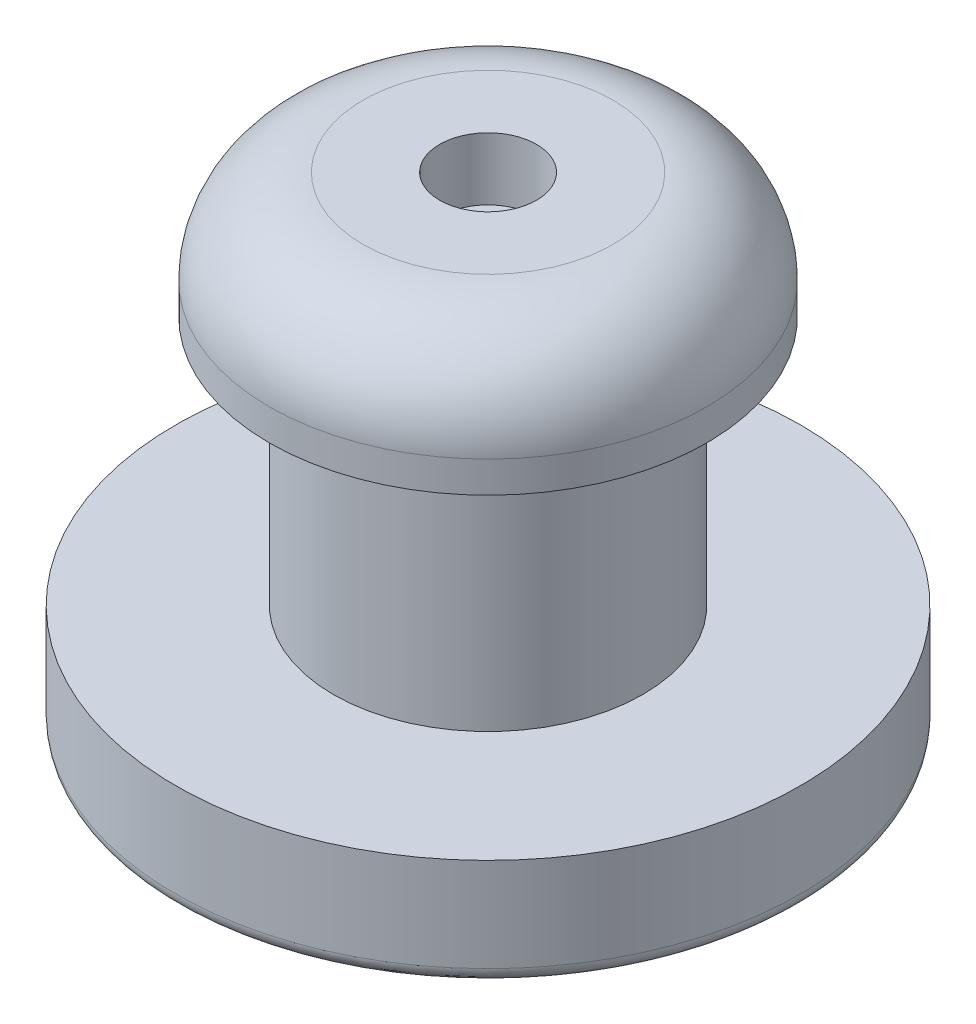
ISO-10303-21;
HEADER;
FILE_DESCRIPTION(('STEP AP214'),'2;1');
FILE_NAME('part.step','',(''),(''),'','','');
FILE_SCHEMA(('AUTOMOTIVE_DESIGN { 1 0 10303 214 1 1 1 1 }'));
ENDSEC;
DATA;
#1=APPLICATION_CONTEXT('core data for automotive mechanical design processes');
#2=APPLICATION_PROTOCOL_DEFINITION('international standard','automotive_design',2000,#1);
#3=PRODUCT_CONTEXT('',#1,'mechanical');
#4=PRODUCT('Part','Part','',(#3));
#5=PRODUCT_RELATED_PRODUCT_CATEGORY('part','',(#4));
#6=PRODUCT_DEFINITION_FORMATION('','',#4);
#7=PRODUCT_DEFINITION_CONTEXT('part definition',#1,'design');
#8=PRODUCT_DEFINITION('design','',#6,#7);
#9=PRODUCT_DEFINITION_SHAPE('','',#8);
#10=(LENGTH_UNIT() NAMED_UNIT(*) SI_UNIT(.MILLI.,.METRE.));
#11=(NAMED_UNIT(*) PLANE_ANGLE_UNIT() SI_UNIT($,.RADIAN.));
#12=(NAMED_UNIT(*) SI_UNIT($,.STERADIAN.) SOLID_ANGLE_UNIT());
#13=UNCERTAINTY_MEASURE_WITH_UNIT(LENGTH_MEASURE(1.E-05),#10,'distance_accuracy_value','');
#14=(GEOMETRIC_REPRESENTATION_CONTEXT(3) GLOBAL_UNCERTAINTY_ASSIGNED_CONTEXT((#13)) GLOBAL_UNIT_ASSIGNED_CONTEXT((#10,
#11,#12)) REPRESENTATION_CONTEXT('',''));
#15=CARTESIAN_POINT('',(0.,0.,0.));
#16=DIRECTION('',(0.,0.,1.));
#17=DIRECTION('',(1.,0.,0.));
#18=AXIS2_PLACEMENT_3D('',#15,#16,#17);
#19=CARTESIAN_POINT('',(0.,8.,0.));
#20=DIRECTION('',(0.,1.,0.));
#21=DIRECTION('',(0.,0.,1.));
#22=AXIS2_PLACEMENT_3D('',#19,#20,#21);
#23=PLANE('',#22);
#24=CARTESIAN_POINT('',(0.,8.,0.));
#25=DIRECTION('',(0.,1.,0.));
#26=DIRECTION('',(0.,0.,1.));
#27=AXIS2_PLACEMENT_3D('',#24,#25,#26);
#28=CIRCLE('',#27,7.);
#29=CARTESIAN_POINT('',(0.,8.,7.));
#30=VERTEX_POINT('',#29);
#31=EDGE_CURVE('E56',#30,#30,#28,.T.);
#32=ORIENTED_EDGE('',*,*,#31,.F.);
#33=EDGE_LOOP('',(#32));
#34=FACE_BOUND('',#33,.T.);
#35=CARTESIAN_POINT('',(0.,8.,0.));
#36=DIRECTION('',(0.,1.,0.));
#37=DIRECTION('',(0.,0.,1.));
#38=AXIS2_PLACEMENT_3D('',#35,#36,#37);
#39=CIRCLE('',#38,5.05);
#40=CARTESIAN_POINT('',(0.,8.,5.05));
#41=VERTEX_POINT('',#40);
#42=EDGE_CURVE('E60',#41,#41,#39,.T.);
#43=ORIENTED_EDGE('',*,*,#42,.T.);
#44=EDGE_LOOP('',(#43));
#45=FACE_BOUND('',#44,.T.);
#46=ADVANCED_FACE('F45',(#34,#45),#23,.F.);
#47=CARTESIAN_POINT('',(0.,10.,0.));
#48=DIRECTION('',(0.,-1.,0.));
#49=DIRECTION('',(0.,0.,-1.));
#50=AXIS2_PLACEMENT_3D('',#47,#48,#49);
#51=CYLINDRICAL_SURFACE('',#50,7.);
#52=CARTESIAN_POINT('',(0.,9.,0.));
#53=DIRECTION('',(0.,1.,0.));
#54=DIRECTION('',(0.,0.,1.));
#55=AXIS2_PLACEMENT_3D('',#52,#53,#54);
#56=CIRCLE('',#55,7.);
#57=CARTESIAN_POINT('',(0.,9.,7.));
#58=VERTEX_POINT('',#57);
#59=EDGE_CURVE('E11',#58,#58,#56,.F.);
#60=ORIENTED_EDGE('',*,*,#59,.T.);
#61=EDGE_LOOP('',(#60));
#62=FACE_BOUND('',#61,.T.);
#63=ORIENTED_EDGE('',*,*,#31,.T.);
#64=EDGE_LOOP('',(#63));
#65=FACE_BOUND('',#64,.T.);
#66=ADVANCED_FACE('F91',(#62,#65),#51,.T.);
#67=CARTESIAN_POINT('',(0.,10.,0.));
#68=DIRECTION('',(0.,-1.,0.));
#69=DIRECTION('',(0.,0.,-1.));
#70=AXIS2_PLACEMENT_3D('',#67,#68,#69);
#71=CYLINDRICAL_SURFACE('',#70,5.05);
#72=CARTESIAN_POINT('',(0.,10.,0.));
#73=DIRECTION('',(0.,1.,0.));
#74=DIRECTION('',(0.,0.,1.));
#75=AXIS2_PLACEMENT_3D('',#72,#73,#74);
#76=CIRCLE('',#75,5.05);
#77=CARTESIAN_POINT('',(0.,10.,5.05));
#78=VERTEX_POINT('',#77);
#79=EDGE_CURVE('E65',#78,#78,#76,.T.);
#80=ORIENTED_EDGE('',*,*,#79,.T.);
#81=EDGE_LOOP('',(#80));
#82=FACE_BOUND('',#81,.T.);
#83=ORIENTED_EDGE('',*,*,#42,.F.);
#84=EDGE_LOOP('',(#83));
#85=FACE_BOUND('',#84,.T.);
#86=ADVANCED_FACE('F87',(#82,#85),#71,.F.);
#87=CARTESIAN_POINT('',(0.,10.,0.));
#88=DIRECTION('',(0.,1.,0.));
#89=DIRECTION('',(0.,0.,1.));
#90=AXIS2_PLACEMENT_3D('',#87,#88,#89);
#91=PLANE('',#90);
#92=CARTESIAN_POINT('',(0.,10.,0.));
#93=DIRECTION('',(0.,1.,0.));
#94=DIRECTION('',(0.,0.,1.));
#95=AXIS2_PLACEMENT_3D('',#92,#93,#94);
#96=CIRCLE('',#95,1.55);
#97=CARTESIAN_POINT('',(0.,10.,1.55));
#98=VERTEX_POINT('',#97);
#99=EDGE_CURVE('E68',#98,#98,#96,.T.);
#100=ORIENTED_EDGE('',*,*,#99,.T.);
#101=EDGE_LOOP('',(#100));
#102=FACE_BOUND('',#101,.T.);
#103=ORIENTED_EDGE('',*,*,#79,.F.);
#104=EDGE_LOOP('',(#103));
#105=FACE_BOUND('',#104,.T.);
#106=ADVANCED_FACE('F80',(#102,#105),#91,.F.);
#107=CARTESIAN_POINT('',(0.,12.,0.));
#108=DIRECTION('',(0.,1.,0.));
#109=DIRECTION('',(0.,0.,1.));
#110=AXIS2_PLACEMENT_3D('',#107,#108,#109);
#111=PLANE('',#110);
#112=CARTESIAN_POINT('',(0.,12.,0.));
#113=DIRECTION('',(0.,1.,0.));
#114=DIRECTION('',(0.,0.,1.));
#115=AXIS2_PLACEMENT_3D('',#112,#113,#114);
#116=CIRCLE('',#115,4.);
#117=CARTESIAN_POINT('',(0.,12.,4.));
#118=VERTEX_POINT('',#117);
#119=EDGE_CURVE('E52',#118,#118,#116,.T.);
#120=ORIENTED_EDGE('',*,*,#119,.T.);
#121=EDGE_LOOP('',(#120));
#122=FACE_BOUND('',#121,.T.);
#123=CARTESIAN_POINT('',(0.,12.,0.));
#124=DIRECTION('',(0.,1.,0.));
#125=DIRECTION('',(0.,0.,1.));
#126=AXIS2_PLACEMENT_3D('',#123,#124,#125);
#127=CIRCLE('',#126,1.55);
#128=CARTESIAN_POINT('',(0.,12.,1.55));
#129=VERTEX_POINT('',#128);
#130=EDGE_CURVE('E71',#129,#129,#127,.T.);
#131=ORIENTED_EDGE('',*,*,#130,.F.);
#132=EDGE_LOOP('',(#131));
#133=FACE_BOUND('',#132,.T.);
#134=ADVANCED_FACE('F78',(#122,#133),#111,.T.);
#135=CARTESIAN_POINT('',(0.,-3.5,0.));
#136=DIRECTION('',(0.,1.,0.));
#137=DIRECTION('',(0.,0.,1.));
#138=AXIS2_PLACEMENT_3D('',#135,#136,#137);
#139=CYLINDRICAL_SURFACE('',#138,1.55);
#140=ORIENTED_EDGE('',*,*,#130,.T.);
#141=EDGE_LOOP('',(#140));
#142=FACE_BOUND('',#141,.T.);
#143=ORIENTED_EDGE('',*,*,#99,.F.);
#144=EDGE_LOOP('',(#143));
#145=FACE_BOUND('',#144,.T.);
#146=ADVANCED_FACE('F75',(#142,#145),#139,.F.);
#147=CARTESIAN_POINT('',(0.,9.,0.));
#148=DIRECTION('',(0.,1.,0.));
#149=DIRECTION('',(0.,0.,1.));
#150=AXIS2_PLACEMENT_3D('',#147,#148,#149);
#151=TOROIDAL_SURFACE('',#150,4.,3.);
#152=ORIENTED_EDGE('',*,*,#59,.F.);
#153=EDGE_LOOP('',(#152));
#154=FACE_BOUND('',#153,.T.);
#155=ORIENTED_EDGE('',*,*,#119,.F.);
#156=EDGE_LOOP('',(#155));
#157=FACE_BOUND('',#156,.T.);
#158=ADVANCED_FACE('F47',(#154,#157),#151,.T.);
#159=CLOSED_SHELL('',(#46,#66,#86,#106,#134,#146,#158));
#160=MANIFOLD_SOLID_BREP('B2',#159);
#161=CARTESIAN_POINT('',(0.,-3.5,0.));
#162=DIRECTION('',(0.,1.,0.));
#163=DIRECTION('',(0.,0.,1.));
#164=AXIS2_PLACEMENT_3D('',#161,#162,#163);
#165=CYLINDRICAL_SURFACE('',#164,1.55);
#166=CARTESIAN_POINT('',(0.,9.,0.));
#167=DIRECTION('',(0.,1.,0.));
#168=DIRECTION('',(0.,0.,1.));
#169=AXIS2_PLACEMENT_3D('',#166,#167,#168);
#170=CIRCLE('',#169,1.55);
#171=CARTESIAN_POINT('',(0.,9.,1.55));
#172=VERTEX_POINT('',#171);
#173=EDGE_CURVE('E263',#172,#172,#170,.T.);
#174=CARTESIAN_POINT('',(0.,0.5,0.));
#175=DIRECTION('',(0.,-1.,0.));
#176=DIRECTION('',(0.,0.,-1.));
#177=AXIS2_PLACEMENT_3D('',#174,#175,#176);
#178=CIRCLE('',#177,1.55);
#179=CARTESIAN_POINT('',(0.,0.500000000000001,1.55));
#180=VERTEX_POINT('',#179);
#181=EDGE_CURVE('E257',#180,#180,#178,.F.);
#182=CARTESIAN_POINT('',(0.,9.,1.55));
#183=CARTESIAN_POINT('',(0.,8.91145833333333,1.55));
#184=CARTESIAN_POINT('',(0.,8.82291666666667,1.55));
#185=CARTESIAN_POINT('',(0.,8.64583333333333,1.55));
#186=CARTESIAN_POINT('',(0.,8.55729166666667,1.55));
#187=CARTESIAN_POINT('',(0.,8.38020833333333,1.55));
#188=CARTESIAN_POINT('',(0.,8.29166666666667,1.55));
#189=CARTESIAN_POINT('',(0.,8.11458333333333,1.55));
#190=CARTESIAN_POINT('',(0.,8.02604166666667,1.55));
#191=CARTESIAN_POINT('',(0.,7.84895833333333,1.55));
#192=CARTESIAN_POINT('',(0.,7.76041666666667,1.55));
#193=CARTESIAN_POINT('',(0.,7.58333333333333,1.55));
#194=CARTESIAN_POINT('',(0.,7.49479166666667,1.55));
#195=CARTESIAN_POINT('',(0.,7.31770833333333,1.55));
#196=CARTESIAN_POINT('',(0.,7.22916666666667,1.55));
#197=CARTESIAN_POINT('',(0.,7.05208333333333,1.55));
#198=CARTESIAN_POINT('',(0.,6.96354166666667,1.55));
#199=CARTESIAN_POINT('',(0.,6.78645833333333,1.55));
#200=CARTESIAN_POINT('',(0.,6.69791666666667,1.55));
#201=CARTESIAN_POINT('',(0.,6.52083333333333,1.55));
#202=CARTESIAN_POINT('',(0.,6.43229166666667,1.55));
#203=CARTESIAN_POINT('',(0.,6.25520833333333,1.55));
#204=CARTESIAN_POINT('',(0.,6.16666666666667,1.55));
#205=CARTESIAN_POINT('',(0.,5.98958333333333,1.55));
#206=CARTESIAN_POINT('',(0.,5.90104166666667,1.55));
#207=CARTESIAN_POINT('',(0.,5.72395833333333,1.55));
#208=CARTESIAN_POINT('',(0.,5.63541666666667,1.55));
#209=CARTESIAN_POINT('',(0.,5.45833333333333,1.55));
#210=CARTESIAN_POINT('',(0.,5.36979166666667,1.55));
#211=CARTESIAN_POINT('',(0.,5.19270833333333,1.55));
#212=CARTESIAN_POINT('',(0.,5.10416666666667,1.55));
#213=CARTESIAN_POINT('',(0.,4.92708333333333,1.55));
#214=CARTESIAN_POINT('',(0.,4.83854166666667,1.55));
#215=CARTESIAN_POINT('',(0.,4.66145833333333,1.55));
#216=CARTESIAN_POINT('',(0.,4.57291666666667,1.55));
#217=CARTESIAN_POINT('',(0.,4.39583333333333,1.55));
#218=CARTESIAN_POINT('',(0.,4.30729166666667,1.55));
#219=CARTESIAN_POINT('',(0.,4.13020833333333,1.55));
#220=CARTESIAN_POINT('',(0.,4.04166666666667,1.55));
#221=CARTESIAN_POINT('',(0.,3.86458333333333,1.55));
#222=CARTESIAN_POINT('',(0.,3.77604166666667,1.55));
#223=CARTESIAN_POINT('',(0.,3.59895833333333,1.55));
#224=CARTESIAN_POINT('',(0.,3.51041666666667,1.55));
#225=CARTESIAN_POINT('',(0.,3.33333333333333,1.55));
#226=CARTESIAN_POINT('',(0.,3.24479166666667,1.55));
#227=CARTESIAN_POINT('',(0.,3.06770833333333,1.55));
#228=CARTESIAN_POINT('',(0.,2.97916666666667,1.55));
#229=CARTESIAN_POINT('',(0.,2.80208333333333,1.55));
#230=CARTESIAN_POINT('',(0.,2.71354166666667,1.55));
#231=CARTESIAN_POINT('',(0.,2.53645833333333,1.55));
#232=CARTESIAN_POINT('',(0.,2.44791666666667,1.55));
#233=CARTESIAN_POINT('',(0.,2.27083333333333,1.55));
#234=CARTESIAN_POINT('',(0.,2.18229166666667,1.55));
#235=CARTESIAN_POINT('',(0.,2.00520833333333,1.55));
#236=CARTESIAN_POINT('',(0.,1.91666666666667,1.55));
#237=CARTESIAN_POINT('',(0.,1.73958333333333,1.55));
#238=CARTESIAN_POINT('',(0.,1.65104166666667,1.55));
#239=CARTESIAN_POINT('',(0.,1.47395833333333,1.55));
#240=CARTESIAN_POINT('',(0.,1.38541666666667,1.55));
#241=CARTESIAN_POINT('',(0.,1.20833333333333,1.55));
#242=CARTESIAN_POINT('',(0.,1.11979166666667,1.55));
#243=CARTESIAN_POINT('',(0.,0.942708333333335,1.55));
#244=CARTESIAN_POINT('',(0.,0.854166666666668,1.55));
#245=CARTESIAN_POINT('',(0.,0.677083333333335,1.55));
#246=CARTESIAN_POINT('',(0.,0.588541666666668,1.55));
#247=CARTESIAN_POINT('',(0.,0.500000000000001,1.55));
#248=B_SPLINE_CURVE_WITH_KNOTS('',3,(#182,#183,#184,#185,#186,#187,#188,#189,#190,#191,#192,
#193,#194,#195,#196,#197,#198,#199,#200,#201,#202,#203,#204,#205,#206,#207,#208,#209,#210,#211,
#212,#213,#214,#215,#216,#217,#218,#219,#220,#221,#222,#223,#224,#225,#226,#227,#228,#229,#230,
#231,#232,#233,#234,#235,#236,#237,#238,#239,#240,#241,#242,#243,#244,#245,#246,#247),
.UNSPECIFIED.,.F.,.F.,(4,2,2,2,2,2,2,2,2,2,2,2,2,2,2,2,2,2,2,2,2,2,2,2,2,2,2,2,2,2,2,2,4),(0.,
0.265625,0.53125,0.796874999999999,1.0625,1.328125,1.59375,1.859375,2.125,2.390625,2.65625,
2.921875,3.1875,3.453125,3.71875,3.984375,4.25,4.515625,4.78125,5.046875,5.3125,5.578125,
5.84375,6.109375,6.375,6.640625,6.90625,7.171875,7.4375,7.703125,7.96875,8.234375,8.5),.UNSPECIFIED.);
#249=EDGE_CURVE('BSEAM154',#172,#180,#248,.T.);
#250=ORIENTED_EDGE('',*,*,#173,.T.);
#251=ORIENTED_EDGE('',*,*,#181,.F.);
#252=ORIENTED_EDGE('',*,*,#249,.T.);
#253=ORIENTED_EDGE('',*,*,#249,.F.);
#254=EDGE_LOOP('',(#250,#252,#251,#253));
#255=FACE_BOUND('',#254,.T.);
#256=ADVANCED_FACE('F154',(#255),#165,.F.);
#257=CARTESIAN_POINT('',(0.,9.,0.));
#258=DIRECTION('',(0.,-1.,0.));
#259=DIRECTION('',(0.,0.,-1.));
#260=AXIS2_PLACEMENT_3D('',#257,#258,#259);
#261=CYLINDRICAL_SURFACE('',#260,4.95);
#262=CARTESIAN_POINT('',(0.,9.,0.));
#263=DIRECTION('',(0.,1.,0.));
#264=DIRECTION('',(0.,0.,1.));
#265=AXIS2_PLACEMENT_3D('',#262,#263,#264);
#266=CIRCLE('',#265,4.95);
#267=CARTESIAN_POINT('',(0.,9.,4.95));
#268=VERTEX_POINT('',#267);
#269=EDGE_CURVE('E276',#268,#268,#266,.T.);
#270=ORIENTED_EDGE('',*,*,#269,.F.);
#271=EDGE_LOOP('',(#270));
#272=FACE_BOUND('',#271,.T.);
#273=CARTESIAN_POINT('',(0.,0.,0.));
#274=DIRECTION('',(0.,1.,0.));
#275=DIRECTION('',(0.,0.,1.));
#276=AXIS2_PLACEMENT_3D('',#273,#274,#275);
#277=CIRCLE('',#276,4.95);
#278=CARTESIAN_POINT('',(0.,0.,4.95));
#279=VERTEX_POINT('',#278);
#280=EDGE_CURVE('E275',#279,#279,#277,.T.);
#281=ORIENTED_EDGE('',*,*,#280,.T.);
#282=EDGE_LOOP('',(#281));
#283=FACE_BOUND('',#282,.T.);
#284=ADVANCED_FACE('F299',(#272,#283),#261,.T.);
#285=CARTESIAN_POINT('',(0.,9.,0.));
#286=DIRECTION('',(0.,1.,0.));
#287=DIRECTION('',(0.,0.,1.));
#288=AXIS2_PLACEMENT_3D('',#285,#286,#287);
#289=PLANE('',#288);
#290=ORIENTED_EDGE('',*,*,#173,.F.);
#291=EDGE_LOOP('',(#290));
#292=FACE_BOUND('',#291,.T.);
#293=ORIENTED_EDGE('',*,*,#269,.T.);
#294=EDGE_LOOP('',(#293));
#295=FACE_BOUND('',#294,.T.);
#296=ADVANCED_FACE('F305',(#292,#295),#289,.T.);
#297=CARTESIAN_POINT('',(0.,-3.5,0.));
#298=DIRECTION('',(0.,1.,0.));
#299=DIRECTION('',(0.,0.,1.));
#300=AXIS2_PLACEMENT_3D('',#297,#298,#299);
#301=CYLINDRICAL_SURFACE('',#300,10.);
#302=CARTESIAN_POINT('',(0.,-3.,0.));
#303=DIRECTION('',(0.,-1.,0.));
#304=DIRECTION('',(0.,0.,-1.));
#305=AXIS2_PLACEMENT_3D('',#302,#303,#304);
#306=CIRCLE('',#305,10.);
#307=CARTESIAN_POINT('',(0.,-3.,-10.));
#308=VERTEX_POINT('',#307);
#309=EDGE_CURVE('E43',#308,#308,#306,.F.);
#310=ORIENTED_EDGE('',*,*,#309,.T.);
#311=EDGE_LOOP('',(#310));
#312=FACE_BOUND('',#311,.T.);
#313=CARTESIAN_POINT('',(0.,0.,0.));
#314=DIRECTION('',(0.,-1.,0.));
#315=DIRECTION('',(0.,0.,-1.));
#316=AXIS2_PLACEMENT_3D('',#313,#314,#315);
#317=CIRCLE('',#316,10.);
#318=CARTESIAN_POINT('',(0.,0.,-10.));
#319=VERTEX_POINT('',#318);
#320=EDGE_CURVE('E270',#319,#319,#317,.T.);
#321=ORIENTED_EDGE('',*,*,#320,.T.);
#322=EDGE_LOOP('',(#321));
#323=FACE_BOUND('',#322,.T.);
#324=ADVANCED_FACE('F322',(#312,#323),#301,.T.);
#325=CARTESIAN_POINT('',(0.,-3.5,0.));
#326=DIRECTION('',(0.,-1.,0.));
#327=DIRECTION('',(0.,0.,-1.));
#328=AXIS2_PLACEMENT_3D('',#325,#326,#327);
#329=PLANE('',#328);
#330=CARTESIAN_POINT('',(0.,-3.5,0.));
#331=DIRECTION('',(0.,-1.,0.));
#332=DIRECTION('',(0.,0.,-1.));
#333=AXIS2_PLACEMENT_3D('',#330,#331,#332);
#334=CIRCLE('',#333,9.5);
#335=CARTESIAN_POINT('',(0.,-3.5,-9.5));
#336=VERTEX_POINT('',#335);
#337=EDGE_CURVE('E162',#336,#336,#334,.T.);
#338=ORIENTED_EDGE('',*,*,#337,.T.);
#339=EDGE_LOOP('',(#338));
#340=FACE_BOUND('',#339,.T.);
#341=CARTESIAN_POINT('',(0.,-3.5,0.));
#342=DIRECTION('',(0.,-1.,0.));
#343=DIRECTION('',(0.,0.,-1.));
#344=AXIS2_PLACEMENT_3D('',#341,#342,#343);
#345=CIRCLE('',#344,9.);
#346=CARTESIAN_POINT('',(0.,-3.5,-9.));
#347=VERTEX_POINT('',#346);
#348=EDGE_CURVE('E266',#347,#347,#345,.T.);
#349=ORIENTED_EDGE('',*,*,#348,.F.);
#350=EDGE_LOOP('',(#349));
#351=FACE_BOUND('',#350,.T.);
#352=ADVANCED_FACE('F285',(#340,#351),#329,.T.);
#353=CARTESIAN_POINT('',(0.,0.,0.));
#354=DIRECTION('',(0.,-1.,0.));
#355=DIRECTION('',(0.,0.,-1.));
#356=AXIS2_PLACEMENT_3D('',#353,#354,#355);
#357=PLANE('',#356);
#358=ORIENTED_EDGE('',*,*,#280,.F.);
#359=EDGE_LOOP('',(#358));
#360=FACE_BOUND('',#359,.T.);
#361=ORIENTED_EDGE('',*,*,#320,.F.);
#362=EDGE_LOOP('',(#361));
#363=FACE_BOUND('',#362,.T.);
#364=ADVANCED_FACE('F318',(#360,#363),#357,.F.);
#365=CARTESIAN_POINT('',(0.,-2.,0.));
#366=DIRECTION('',(0.,-1.,0.));
#367=DIRECTION('',(0.,0.,-1.));
#368=AXIS2_PLACEMENT_3D('',#365,#366,#367);
#369=CYLINDRICAL_SURFACE('',#368,9.);
#370=CARTESIAN_POINT('',(0.,-2.,0.));
#371=DIRECTION('',(0.,-1.,0.));
#372=DIRECTION('',(0.,0.,-1.));
#373=AXIS2_PLACEMENT_3D('',#370,#371,#372);
#374=CIRCLE('',#373,9.);
#375=CARTESIAN_POINT('',(0.,-2.,-9.));
#376=VERTEX_POINT('',#375);
#377=EDGE_CURVE('E267',#376,#376,#374,.T.);
#378=ORIENTED_EDGE('',*,*,#377,.F.);
#379=EDGE_LOOP('',(#378));
#380=FACE_BOUND('',#379,.T.);
#381=ORIENTED_EDGE('',*,*,#348,.T.);
#382=EDGE_LOOP('',(#381));
#383=FACE_BOUND('',#382,.T.);
#384=ADVANCED_FACE('F314',(#380,#383),#369,.F.);
#385=CARTESIAN_POINT('',(0.,-2.,0.));
#386=DIRECTION('',(0.,-1.,0.));
#387=DIRECTION('',(0.,0.,-1.));
#388=AXIS2_PLACEMENT_3D('',#385,#386,#387);
#389=PLANE('',#388);
#390=DIRECTION('',(-0.5,0.,0.866025403784439));
#391=VECTOR('',#390,1.);
#392=CARTESIAN_POINT('',(3.40636658821879,-2.,0.));
#393=LINE('',#392,#391);
#394=CARTESIAN_POINT('',(3.40636658821879,-2.,0.));
#395=VERTEX_POINT('',#394);
#396=CARTESIAN_POINT('',(1.7031832941094,-2.,2.95));
#397=VERTEX_POINT('',#396);
#398=EDGE_CURVE('E169',#395,#397,#393,.T.);
#399=ORIENTED_EDGE('',*,*,#398,.F.);
#400=DIRECTION('',(0.5,0.,0.866025403784439));
#401=VECTOR('',#400,1.);
#402=CARTESIAN_POINT('',(1.7031832941094,-2.,-2.95));
#403=LINE('',#402,#401);
#404=CARTESIAN_POINT('',(1.7031832941094,-2.,-2.95));
#405=VERTEX_POINT('',#404);
#406=EDGE_CURVE('E253',#405,#395,#403,.T.);
#407=ORIENTED_EDGE('',*,*,#406,.F.);
#408=DIRECTION('',(1.,0.,0.));
#409=VECTOR('',#408,1.);
#410=CARTESIAN_POINT('',(-1.70318329410939,-2.,-2.95));
#411=LINE('',#410,#409);
#412=CARTESIAN_POINT('',(-1.70318329410939,-2.,-2.95));
#413=VERTEX_POINT('',#412);
#414=EDGE_CURVE('E251',#413,#405,#411,.T.);
#415=ORIENTED_EDGE('',*,*,#414,.F.);
#416=DIRECTION('',(0.5,0.,-0.866025403784438));
#417=VECTOR('',#416,1.);
#418=CARTESIAN_POINT('',(-3.40636658821879,-2.,0.));
#419=LINE('',#418,#417);
#420=CARTESIAN_POINT('',(-3.40636658821879,-2.,0.));
#421=VERTEX_POINT('',#420);
#422=EDGE_CURVE('E217',#421,#413,#419,.T.);
#423=ORIENTED_EDGE('',*,*,#422,.F.);
#424=DIRECTION('',(-0.5,0.,-0.866025403784439));
#425=VECTOR('',#424,1.);
#426=CARTESIAN_POINT('',(-1.7031832941094,-2.,2.95));
#427=LINE('',#426,#425);
#428=CARTESIAN_POINT('',(-1.7031832941094,-2.,2.95));
#429=VERTEX_POINT('',#428);
#430=EDGE_CURVE('E247',#429,#421,#427,.T.);
#431=ORIENTED_EDGE('',*,*,#430,.F.);
#432=DIRECTION('',(-1.,0.,0.));
#433=VECTOR('',#432,1.);
#434=CARTESIAN_POINT('',(1.7031832941094,-2.,2.95));
#435=LINE('',#434,#433);
#436=EDGE_CURVE('E244',#397,#429,#435,.T.);
#437=ORIENTED_EDGE('',*,*,#436,.F.);
#438=EDGE_LOOP('',(#399,#407,#415,#423,#431,#437));
#439=FACE_BOUND('',#438,.T.);
#440=ORIENTED_EDGE('',*,*,#377,.T.);
#441=EDGE_LOOP('',(#440));
#442=FACE_BOUND('',#441,.T.);
#443=ADVANCED_FACE('F311',(#439,#442),#389,.T.);
#444=CARTESIAN_POINT('',(0.,0.5,0.));
#445=DIRECTION('',(0.,-1.,0.));
#446=DIRECTION('',(0.,0.,-1.));
#447=AXIS2_PLACEMENT_3D('',#444,#445,#446);
#448=PLANE('',#447);
#449=DIRECTION('',(-0.5,0.,0.866025403784439));
#450=VECTOR('',#449,1.);
#451=CARTESIAN_POINT('',(3.40636658821879,0.5,0.));
#452=LINE('',#451,#450);
#453=CARTESIAN_POINT('',(3.40636658821879,0.5,0.));
#454=VERTEX_POINT('',#453);
#455=CARTESIAN_POINT('',(1.7031832941094,0.5,2.95));
#456=VERTEX_POINT('',#455);
#457=EDGE_CURVE('E255',#454,#456,#452,.T.);
#458=ORIENTED_EDGE('',*,*,#457,.T.);
#459=DIRECTION('',(-1.,0.,0.));
#460=VECTOR('',#459,1.);
#461=CARTESIAN_POINT('',(1.7031832941094,0.5,2.95));
#462=LINE('',#461,#460);
#463=CARTESIAN_POINT('',(-1.7031832941094,0.5,2.95));
#464=VERTEX_POINT('',#463);
#465=EDGE_CURVE('E238',#456,#464,#462,.T.);
#466=ORIENTED_EDGE('',*,*,#465,.T.);
#467=DIRECTION('',(-0.5,0.,-0.866025403784439));
#468=VECTOR('',#467,1.);
#469=CARTESIAN_POINT('',(-1.7031832941094,0.5,2.95));
#470=LINE('',#469,#468);
#471=CARTESIAN_POINT('',(-3.40636658821879,0.5,0.));
#472=VERTEX_POINT('',#471);
#473=EDGE_CURVE('E236',#464,#472,#470,.T.);
#474=ORIENTED_EDGE('',*,*,#473,.T.);
#475=DIRECTION('',(0.5,0.,-0.866025403784438));
#476=VECTOR('',#475,1.);
#477=CARTESIAN_POINT('',(-3.40636658821879,0.5,0.));
#478=LINE('',#477,#476);
#479=CARTESIAN_POINT('',(-1.70318329410939,0.5,-2.95));
#480=VERTEX_POINT('',#479);
#481=EDGE_CURVE('E214',#472,#480,#478,.T.);
#482=ORIENTED_EDGE('',*,*,#481,.T.);
#483=DIRECTION('',(1.,0.,0.));
#484=VECTOR('',#483,1.);
#485=CARTESIAN_POINT('',(-1.70318329410939,0.5,-2.95));
#486=LINE('',#485,#484);
#487=CARTESIAN_POINT('',(1.7031832941094,0.5,-2.95));
#488=VERTEX_POINT('',#487);
#489=EDGE_CURVE('E225',#480,#488,#486,.T.);
#490=ORIENTED_EDGE('',*,*,#489,.T.);
#491=DIRECTION('',(0.5,0.,0.866025403784439));
#492=VECTOR('',#491,1.);
#493=CARTESIAN_POINT('',(1.7031832941094,0.5,-2.95));
#494=LINE('',#493,#492);
#495=EDGE_CURVE('E229',#488,#454,#494,.T.);
#496=ORIENTED_EDGE('',*,*,#495,.T.);
#497=EDGE_LOOP('',(#458,#466,#474,#482,#490,#496));
#498=FACE_BOUND('',#497,.T.);
#499=ORIENTED_EDGE('',*,*,#181,.T.);
#500=EDGE_LOOP('',(#499));
#501=FACE_BOUND('',#500,.T.);
#502=ADVANCED_FACE('F232',(#498,#501),#448,.T.);
#503=CARTESIAN_POINT('',(3.40636658821879,0.5,0.));
#504=DIRECTION('',(0.866025403784439,0.,0.5));
#505=DIRECTION('',(0.5,0.,-0.866025403784439));
#506=AXIS2_PLACEMENT_3D('',#503,#504,#505);
#507=PLANE('',#506);
#508=ORIENTED_EDGE('',*,*,#398,.T.);
#509=DIRECTION('',(0.,-1.,0.));
#510=VECTOR('',#509,1.);
#511=CARTESIAN_POINT('',(1.7031832941094,0.5,2.95));
#512=LINE('',#511,#510);
#513=EDGE_CURVE('E199',#456,#397,#512,.T.);
#514=ORIENTED_EDGE('',*,*,#513,.F.);
#515=ORIENTED_EDGE('',*,*,#457,.F.);
#516=DIRECTION('',(0.,-1.,0.));
#517=VECTOR('',#516,1.);
#518=CARTESIAN_POINT('',(3.40636658821879,0.5,0.));
#519=LINE('',#518,#517);
#520=EDGE_CURVE('E177',#454,#395,#519,.T.);
#521=ORIENTED_EDGE('',*,*,#520,.T.);
#522=EDGE_LOOP('',(#508,#514,#515,#521));
#523=FACE_BOUND('',#522,.T.);
#524=ADVANCED_FACE('F310',(#523),#507,.F.);
#525=CARTESIAN_POINT('',(1.7031832941094,0.5,-2.95));
#526=DIRECTION('',(0.866025403784439,0.,-0.5));
#527=DIRECTION('',(-0.5,0.,-0.866025403784439));
#528=AXIS2_PLACEMENT_3D('',#525,#526,#527);
#529=PLANE('',#528);
#530=ORIENTED_EDGE('',*,*,#406,.T.);
#531=ORIENTED_EDGE('',*,*,#520,.F.);
#532=ORIENTED_EDGE('',*,*,#495,.F.);
#533=DIRECTION('',(0.,-1.,0.));
#534=VECTOR('',#533,1.);
#535=CARTESIAN_POINT('',(1.7031832941094,0.5,-2.95));
#536=LINE('',#535,#534);
#537=EDGE_CURVE('E221',#488,#405,#536,.T.);
#538=ORIENTED_EDGE('',*,*,#537,.T.);
#539=EDGE_LOOP('',(#530,#531,#532,#538));
#540=FACE_BOUND('',#539,.T.);
#541=ADVANCED_FACE('F376',(#540),#529,.F.);
#542=CARTESIAN_POINT('',(-1.70318329410939,0.5,-2.95));
#543=DIRECTION('',(0.,0.,-1.));
#544=DIRECTION('',(-1.,0.,0.));
#545=AXIS2_PLACEMENT_3D('',#542,#543,#544);
#546=PLANE('',#545);
#547=ORIENTED_EDGE('',*,*,#414,.T.);
#548=ORIENTED_EDGE('',*,*,#537,.F.);
#549=ORIENTED_EDGE('',*,*,#489,.F.);
#550=DIRECTION('',(0.,-1.,0.));
#551=VECTOR('',#550,1.);
#552=CARTESIAN_POINT('',(-1.70318329410939,0.5,-2.95));
#553=LINE('',#552,#551);
#554=EDGE_CURVE('E210',#480,#413,#553,.T.);
#555=ORIENTED_EDGE('',*,*,#554,.T.);
#556=EDGE_LOOP('',(#547,#548,#549,#555));
#557=FACE_BOUND('',#556,.T.);
#558=ADVANCED_FACE('F226',(#557),#546,.F.);
#559=CARTESIAN_POINT('',(-3.40636658821879,0.5,0.));
#560=DIRECTION('',(-0.866025403784438,0.,-0.5));
#561=DIRECTION('',(-0.5,0.,0.866025403784438));
#562=AXIS2_PLACEMENT_3D('',#559,#560,#561);
#563=PLANE('',#562);
#564=ORIENTED_EDGE('',*,*,#422,.T.);
#565=ORIENTED_EDGE('',*,*,#554,.F.);
#566=ORIENTED_EDGE('',*,*,#481,.F.);
#567=DIRECTION('',(0.,-1.,0.));
#568=VECTOR('',#567,1.);
#569=CARTESIAN_POINT('',(-3.40636658821879,0.5,0.));
#570=LINE('',#569,#568);
#571=EDGE_CURVE('E222',#472,#421,#570,.T.);
#572=ORIENTED_EDGE('',*,*,#571,.T.);
#573=EDGE_LOOP('',(#564,#565,#566,#572));
#574=FACE_BOUND('',#573,.T.);
#575=ADVANCED_FACE('F212',(#574),#563,.F.);
#576=CARTESIAN_POINT('',(-1.7031832941094,0.5,2.95));
#577=DIRECTION('',(-0.866025403784439,0.,0.5));
#578=DIRECTION('',(0.5,0.,0.866025403784439));
#579=AXIS2_PLACEMENT_3D('',#576,#577,#578);
#580=PLANE('',#579);
#581=ORIENTED_EDGE('',*,*,#430,.T.);
#582=ORIENTED_EDGE('',*,*,#571,.F.);
#583=ORIENTED_EDGE('',*,*,#473,.F.);
#584=DIRECTION('',(0.,-1.,0.));
#585=VECTOR('',#584,1.);
#586=CARTESIAN_POINT('',(-1.7031832941094,0.5,2.95));
#587=LINE('',#586,#585);
#588=EDGE_CURVE('E260',#464,#429,#587,.T.);
#589=ORIENTED_EDGE('',*,*,#588,.T.);
#590=EDGE_LOOP('',(#581,#582,#583,#589));
#591=FACE_BOUND('',#590,.T.);
#592=ADVANCED_FACE('F294',(#591),#580,.F.);
#593=CARTESIAN_POINT('',(1.7031832941094,0.5,2.95));
#594=DIRECTION('',(0.,0.,1.));
#595=DIRECTION('',(1.,0.,0.));
#596=AXIS2_PLACEMENT_3D('',#593,#594,#595);
#597=PLANE('',#596);
#598=ORIENTED_EDGE('',*,*,#436,.T.);
#599=ORIENTED_EDGE('',*,*,#588,.F.);
#600=ORIENTED_EDGE('',*,*,#465,.F.);
#601=ORIENTED_EDGE('',*,*,#513,.T.);
#602=EDGE_LOOP('',(#598,#599,#600,#601));
#603=FACE_BOUND('',#602,.T.);
#604=ADVANCED_FACE('F289',(#603),#597,.F.);
#605=CARTESIAN_POINT('',(0.,-3.,0.));
#606=DIRECTION('',(0.,-1.,0.));
#607=DIRECTION('',(0.,0.,-1.));
#608=AXIS2_PLACEMENT_3D('',#605,#606,#607);
#609=TOROIDAL_SURFACE('',#608,9.5,0.5);
#610=ORIENTED_EDGE('',*,*,#309,.F.);
#611=EDGE_LOOP('',(#610));
#612=FACE_BOUND('',#611,.T.);
#613=ORIENTED_EDGE('',*,*,#337,.F.);
#614=EDGE_LOOP('',(#613));
#615=FACE_BOUND('',#614,.T.);
#616=ADVANCED_FACE('F156',(#612,#615),#609,.T.);
#617=CLOSED_SHELL('',(#256,#284,#296,#324,#352,#364,#384,#443,#502,#524,#541,#558,#575,#592,
#604,#616));
#618=MANIFOLD_SOLID_BREP('B6',#617);
#619=ADVANCED_BREP_SHAPE_REPRESENTATION('',(#18,#160,#618),#14);
#620=SHAPE_DEFINITION_REPRESENTATION(#9,#619);
ENDSEC;
END-ISO-10303-21;
